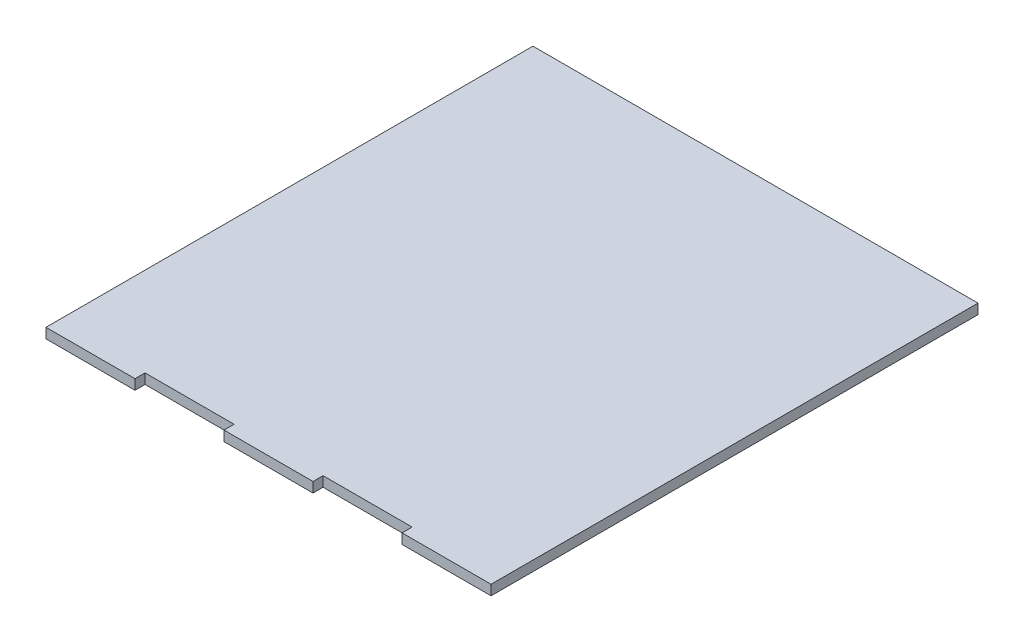
ISO-10303-21;
HEADER;
FILE_DESCRIPTION(('STEP AP214'),'2;1');
FILE_NAME('part.step','',(''),(''),'','','');
FILE_SCHEMA(('AUTOMOTIVE_DESIGN { 1 0 10303 214 1 1 1 1 }'));
ENDSEC;
DATA;
#1=APPLICATION_CONTEXT('core data for automotive mechanical design processes');
#2=APPLICATION_PROTOCOL_DEFINITION('international standard','automotive_design',2000,#1);
#3=PRODUCT_CONTEXT('',#1,'mechanical');
#4=PRODUCT('Part','Part','',(#3));
#5=PRODUCT_RELATED_PRODUCT_CATEGORY('part','',(#4));
#6=PRODUCT_DEFINITION_FORMATION('','',#4);
#7=PRODUCT_DEFINITION_CONTEXT('part definition',#1,'design');
#8=PRODUCT_DEFINITION('design','',#6,#7);
#9=PRODUCT_DEFINITION_SHAPE('','',#8);
#10=(LENGTH_UNIT() NAMED_UNIT(*) SI_UNIT(.MILLI.,.METRE.));
#11=(NAMED_UNIT(*) PLANE_ANGLE_UNIT() SI_UNIT($,.RADIAN.));
#12=(NAMED_UNIT(*) SI_UNIT($,.STERADIAN.) SOLID_ANGLE_UNIT());
#13=UNCERTAINTY_MEASURE_WITH_UNIT(LENGTH_MEASURE(1.E-05),#10,'distance_accuracy_value','');
#14=(GEOMETRIC_REPRESENTATION_CONTEXT(3) GLOBAL_UNCERTAINTY_ASSIGNED_CONTEXT((#13)) GLOBAL_UNIT_ASSIGNED_CONTEXT((#10,
#11,#12)) REPRESENTATION_CONTEXT('',''));
#15=CARTESIAN_POINT('',(0.,0.,0.));
#16=DIRECTION('',(0.,0.,1.));
#17=DIRECTION('',(1.,0.,0.));
#18=AXIS2_PLACEMENT_3D('',#15,#16,#17);
#19=CARTESIAN_POINT('',(-69.720993227991,8.3312,-3.44018058690745));
#20=DIRECTION('',(0.,0.,-1.));
#21=DIRECTION('',(-1.,0.,0.));
#22=AXIS2_PLACEMENT_3D('',#19,#20,#21);
#23=PLANE('',#22);
#24=DIRECTION('',(1.,0.,0.));
#25=VECTOR('',#24,1.);
#26=CARTESIAN_POINT('',(-69.720993227991,0.,-3.44018058690745));
#27=LINE('',#26,#25);
#28=CARTESIAN_POINT('',(-69.720993227991,0.,-3.44018058690745));
#29=VERTEX_POINT('',#28);
#30=CARTESIAN_POINT('',(4.10410677200893,0.,-3.44018058690745));
#31=VERTEX_POINT('',#30);
#32=EDGE_CURVE('E196',#29,#31,#27,.T.);
#33=ORIENTED_EDGE('',*,*,#32,.T.);
#34=DIRECTION('',(0.,-1.,0.));
#35=VECTOR('',#34,1.);
#36=CARTESIAN_POINT('',(4.10410677200893,8.3312,-3.44018058690745));
#37=LINE('',#36,#35);
#38=CARTESIAN_POINT('',(4.10410677200893,8.3312,-3.44018058690745));
#39=VERTEX_POINT('',#38);
#40=EDGE_CURVE('E152',#39,#31,#37,.T.);
#41=ORIENTED_EDGE('',*,*,#40,.F.);
#42=DIRECTION('',(1.,0.,0.));
#43=VECTOR('',#42,1.);
#44=CARTESIAN_POINT('',(-69.720993227991,8.3312,-3.44018058690745));
#45=LINE('',#44,#43);
#46=CARTESIAN_POINT('',(-69.720993227991,8.3312,-3.44018058690745));
#47=VERTEX_POINT('',#46);
#48=EDGE_CURVE('E142',#47,#39,#45,.T.);
#49=ORIENTED_EDGE('',*,*,#48,.F.);
#50=DIRECTION('',(0.,-1.,0.));
#51=VECTOR('',#50,1.);
#52=CARTESIAN_POINT('',(-69.720993227991,8.3312,-3.44018058690745));
#53=LINE('',#52,#51);
#54=EDGE_CURVE('E11',#47,#29,#53,.T.);
#55=ORIENTED_EDGE('',*,*,#54,.T.);
#56=EDGE_LOOP('',(#33,#41,#49,#55));
#57=FACE_BOUND('',#56,.T.);
#58=ADVANCED_FACE('F33',(#57),#23,.F.);
#59=CARTESIAN_POINT('',(225.579406772009,8.3312,-3.44018058690742));
#60=VERTEX_POINT('',#59);
#61=CARTESIAN_POINT('',(299.404506772009,8.3312,-3.44018058690745));
#62=VERTEX_POINT('',#61);
#63=EDGE_CURVE('E184',#60,#62,#45,.T.);
#64=ORIENTED_EDGE('',*,*,#63,.F.);
#65=DIRECTION('',(0.,-1.,0.));
#66=VECTOR('',#65,1.);
#67=CARTESIAN_POINT('',(225.579406772009,8.3312,-3.44018058690742));
#68=LINE('',#67,#66);
#69=CARTESIAN_POINT('',(225.579406772009,0.,-3.44018058690742));
#70=VERTEX_POINT('',#69);
#71=EDGE_CURVE('E169',#60,#70,#68,.T.);
#72=ORIENTED_EDGE('',*,*,#71,.T.);
#73=CARTESIAN_POINT('',(299.404506772009,0.,-3.44018058690745));
#74=VERTEX_POINT('',#73);
#75=EDGE_CURVE('E195',#70,#74,#27,.T.);
#76=ORIENTED_EDGE('',*,*,#75,.T.);
#77=DIRECTION('',(0.,-1.,0.));
#78=VECTOR('',#77,1.);
#79=CARTESIAN_POINT('',(299.404506772009,8.3312,-3.44018058690745));
#80=LINE('',#79,#78);
#81=EDGE_CURVE('E41',#62,#74,#80,.T.);
#82=ORIENTED_EDGE('',*,*,#81,.F.);
#83=EDGE_LOOP('',(#64,#72,#76,#82));
#84=FACE_BOUND('',#83,.T.);
#85=ADVANCED_FACE('F237',(#84),#23,.F.);
#86=CARTESIAN_POINT('',(-69.720993227991,8.3312,-407.330660586907));
#87=DIRECTION('',(1.,0.,0.));
#88=DIRECTION('',(0.,0.,-1.));
#89=AXIS2_PLACEMENT_3D('',#86,#87,#88);
#90=PLANE('',#89);
#91=DIRECTION('',(0.,0.,1.));
#92=VECTOR('',#91,1.);
#93=CARTESIAN_POINT('',(-69.720993227991,0.,-407.330660586907));
#94=LINE('',#93,#92);
#95=CARTESIAN_POINT('',(-69.720993227991,0.,-407.330660586907));
#96=VERTEX_POINT('',#95);
#97=EDGE_CURVE('E154',#96,#29,#94,.T.);
#98=ORIENTED_EDGE('',*,*,#97,.T.);
#99=ORIENTED_EDGE('',*,*,#54,.F.);
#100=DIRECTION('',(0.,0.,1.));
#101=VECTOR('',#100,1.);
#102=CARTESIAN_POINT('',(-69.720993227991,8.3312,-407.330660586907));
#103=LINE('',#102,#101);
#104=CARTESIAN_POINT('',(-69.720993227991,8.3312,-407.330660586907));
#105=VERTEX_POINT('',#104);
#106=EDGE_CURVE('E182',#105,#47,#103,.T.);
#107=ORIENTED_EDGE('',*,*,#106,.F.);
#108=DIRECTION('',(0.,-1.,0.));
#109=VECTOR('',#108,1.);
#110=CARTESIAN_POINT('',(-69.720993227991,8.3312,-407.330660586907));
#111=LINE('',#110,#109);
#112=EDGE_CURVE('E192',#105,#96,#111,.T.);
#113=ORIENTED_EDGE('',*,*,#112,.T.);
#114=EDGE_LOOP('',(#98,#99,#107,#113));
#115=FACE_BOUND('',#114,.T.);
#116=ADVANCED_FACE('F35',(#115),#90,.F.);
#117=CARTESIAN_POINT('',(77.9292067720089,8.3312,-3.44018058690745));
#118=VERTEX_POINT('',#117);
#119=CARTESIAN_POINT('',(151.754306772009,8.3312,-3.44018058690744));
#120=VERTEX_POINT('',#119);
#121=EDGE_CURVE('E188',#118,#120,#45,.T.);
#122=ORIENTED_EDGE('',*,*,#121,.F.);
#123=DIRECTION('',(0.,-1.,0.));
#124=VECTOR('',#123,1.);
#125=CARTESIAN_POINT('',(77.9292067720089,8.3312,-3.44018058690745));
#126=LINE('',#125,#124);
#127=CARTESIAN_POINT('',(77.9292067720089,0.,-3.44018058690745));
#128=VERTEX_POINT('',#127);
#129=EDGE_CURVE('E155',#118,#128,#126,.T.);
#130=ORIENTED_EDGE('',*,*,#129,.T.);
#131=CARTESIAN_POINT('',(151.754306772009,0.,-3.44018058690745));
#132=VERTEX_POINT('',#131);
#133=EDGE_CURVE('E200',#128,#132,#27,.T.);
#134=ORIENTED_EDGE('',*,*,#133,.T.);
#135=DIRECTION('',(0.,-1.,0.));
#136=VECTOR('',#135,1.);
#137=CARTESIAN_POINT('',(151.754306772009,8.3312,-3.44018058690744));
#138=LINE('',#137,#136);
#139=EDGE_CURVE('E56',#120,#132,#138,.T.);
#140=ORIENTED_EDGE('',*,*,#139,.F.);
#141=EDGE_LOOP('',(#122,#130,#134,#140));
#142=FACE_BOUND('',#141,.T.);
#143=ADVANCED_FACE('F233',(#142),#23,.F.);
#144=CARTESIAN_POINT('',(299.404506772009,8.3312,-407.330660586907));
#145=DIRECTION('',(-1.,0.,0.));
#146=DIRECTION('',(0.,0.,1.));
#147=AXIS2_PLACEMENT_3D('',#144,#145,#146);
#148=PLANE('',#147);
#149=DIRECTION('',(0.,0.,-1.));
#150=VECTOR('',#149,1.);
#151=CARTESIAN_POINT('',(299.404506772009,0.,-407.330660586907));
#152=LINE('',#151,#150);
#153=CARTESIAN_POINT('',(299.404506772009,0.,-407.330660586907));
#154=VERTEX_POINT('',#153);
#155=EDGE_CURVE('E199',#74,#154,#152,.T.);
#156=ORIENTED_EDGE('',*,*,#155,.T.);
#157=DIRECTION('',(0.,-1.,0.));
#158=VECTOR('',#157,1.);
#159=CARTESIAN_POINT('',(299.404506772009,8.3312,-407.330660586907));
#160=LINE('',#159,#158);
#161=CARTESIAN_POINT('',(299.404506772009,8.3312,-407.330660586907));
#162=VERTEX_POINT('',#161);
#163=EDGE_CURVE('E205',#162,#154,#160,.T.);
#164=ORIENTED_EDGE('',*,*,#163,.F.);
#165=DIRECTION('',(0.,0.,-1.));
#166=VECTOR('',#165,1.);
#167=CARTESIAN_POINT('',(299.404506772009,8.3312,-407.330660586907));
#168=LINE('',#167,#166);
#169=EDGE_CURVE('E187',#62,#162,#168,.T.);
#170=ORIENTED_EDGE('',*,*,#169,.F.);
#171=ORIENTED_EDGE('',*,*,#81,.T.);
#172=EDGE_LOOP('',(#156,#164,#170,#171));
#173=FACE_BOUND('',#172,.T.);
#174=ADVANCED_FACE('F212',(#173),#148,.F.);
#175=CARTESIAN_POINT('',(-69.720993227991,8.3312,-407.330660586907));
#176=DIRECTION('',(0.,0.,1.));
#177=DIRECTION('',(1.,0.,0.));
#178=AXIS2_PLACEMENT_3D('',#175,#176,#177);
#179=PLANE('',#178);
#180=DIRECTION('',(-1.,0.,0.));
#181=VECTOR('',#180,1.);
#182=CARTESIAN_POINT('',(-69.720993227991,0.,-407.330660586907));
#183=LINE('',#182,#181);
#184=EDGE_CURVE('E185',#154,#96,#183,.T.);
#185=ORIENTED_EDGE('',*,*,#184,.T.);
#186=ORIENTED_EDGE('',*,*,#112,.F.);
#187=DIRECTION('',(-1.,0.,0.));
#188=VECTOR('',#187,1.);
#189=CARTESIAN_POINT('',(-69.720993227991,8.3312,-407.330660586907));
#190=LINE('',#189,#188);
#191=EDGE_CURVE('E190',#162,#105,#190,.T.);
#192=ORIENTED_EDGE('',*,*,#191,.F.);
#193=ORIENTED_EDGE('',*,*,#163,.T.);
#194=EDGE_LOOP('',(#185,#186,#192,#193));
#195=FACE_BOUND('',#194,.T.);
#196=ADVANCED_FACE('F224',(#195),#179,.F.);
#197=CARTESIAN_POINT('',(0.,8.3312,0.));
#198=DIRECTION('',(0.,1.,0.));
#199=DIRECTION('',(0.,0.,1.));
#200=AXIS2_PLACEMENT_3D('',#197,#198,#199);
#201=PLANE('',#200);
#202=DIRECTION('',(0.,0.,-1.));
#203=VECTOR('',#202,1.);
#204=CARTESIAN_POINT('',(4.10410677200893,8.3312,-3.44018058690745));
#205=LINE('',#204,#203);
#206=CARTESIAN_POINT('',(4.10410677200895,8.3312,-11.7713805869075));
#207=VERTEX_POINT('',#206);
#208=EDGE_CURVE('E124',#39,#207,#205,.T.);
#209=ORIENTED_EDGE('',*,*,#208,.T.);
#210=DIRECTION('',(1.,0.,0.));
#211=VECTOR('',#210,1.);
#212=CARTESIAN_POINT('',(4.10410677200895,8.3312,-11.7713805869075));
#213=LINE('',#212,#211);
#214=CARTESIAN_POINT('',(77.9292067720089,8.3312,-11.7713805869075));
#215=VERTEX_POINT('',#214);
#216=EDGE_CURVE('E133',#207,#215,#213,.T.);
#217=ORIENTED_EDGE('',*,*,#216,.T.);
#218=DIRECTION('',(0.,0.,1.));
#219=VECTOR('',#218,1.);
#220=CARTESIAN_POINT('',(77.9292067720089,8.3312,-3.44018058690745));
#221=LINE('',#220,#219);
#222=EDGE_CURVE('E130',#215,#118,#221,.T.);
#223=ORIENTED_EDGE('',*,*,#222,.T.);
#224=ORIENTED_EDGE('',*,*,#121,.T.);
#225=DIRECTION('',(0.,0.,-1.));
#226=VECTOR('',#225,1.);
#227=CARTESIAN_POINT('',(151.754306772009,8.3312,-3.44018058690744));
#228=LINE('',#227,#226);
#229=CARTESIAN_POINT('',(151.754306772009,8.3312,-11.7713805869074));
#230=VERTEX_POINT('',#229);
#231=EDGE_CURVE('E162',#120,#230,#228,.T.);
#232=ORIENTED_EDGE('',*,*,#231,.T.);
#233=DIRECTION('',(1.,0.,0.));
#234=VECTOR('',#233,1.);
#235=CARTESIAN_POINT('',(225.579406772009,8.3312,-11.7713805869074));
#236=LINE('',#235,#234);
#237=CARTESIAN_POINT('',(225.579406772009,8.3312,-11.7713805869074));
#238=VERTEX_POINT('',#237);
#239=EDGE_CURVE('E166',#230,#238,#236,.T.);
#240=ORIENTED_EDGE('',*,*,#239,.T.);
#241=DIRECTION('',(0.,0.,1.));
#242=VECTOR('',#241,1.);
#243=CARTESIAN_POINT('',(225.579406772009,8.3312,-3.44018058690742));
#244=LINE('',#243,#242);
#245=EDGE_CURVE('E159',#238,#60,#244,.T.);
#246=ORIENTED_EDGE('',*,*,#245,.T.);
#247=ORIENTED_EDGE('',*,*,#63,.T.);
#248=ORIENTED_EDGE('',*,*,#169,.T.);
#249=ORIENTED_EDGE('',*,*,#191,.T.);
#250=ORIENTED_EDGE('',*,*,#106,.T.);
#251=ORIENTED_EDGE('',*,*,#48,.T.);
#252=EDGE_LOOP('',(#209,#217,#223,#224,#232,#240,#246,#247,#248,#249,#250,#251));
#253=FACE_BOUND('',#252,.T.);
#254=ADVANCED_FACE('F140',(#253),#201,.T.);
#255=CARTESIAN_POINT('',(0.,0.,0.));
#256=DIRECTION('',(0.,1.,0.));
#257=DIRECTION('',(0.,0.,1.));
#258=AXIS2_PLACEMENT_3D('',#255,#256,#257);
#259=PLANE('',#258);
#260=DIRECTION('',(1.,0.,0.));
#261=VECTOR('',#260,1.);
#262=CARTESIAN_POINT('',(4.10410677200895,0.,-11.7713805869075));
#263=LINE('',#262,#261);
#264=CARTESIAN_POINT('',(4.10410677200895,0.,-11.7713805869075));
#265=VERTEX_POINT('',#264);
#266=CARTESIAN_POINT('',(77.9292067720089,0.,-11.7713805869075));
#267=VERTEX_POINT('',#266);
#268=EDGE_CURVE('E145',#265,#267,#263,.T.);
#269=ORIENTED_EDGE('',*,*,#268,.F.);
#270=DIRECTION('',(0.,0.,-1.));
#271=VECTOR('',#270,1.);
#272=CARTESIAN_POINT('',(4.10410677200893,0.,-3.44018058690745));
#273=LINE('',#272,#271);
#274=EDGE_CURVE('E48',#31,#265,#273,.T.);
#275=ORIENTED_EDGE('',*,*,#274,.F.);
#276=ORIENTED_EDGE('',*,*,#32,.F.);
#277=ORIENTED_EDGE('',*,*,#97,.F.);
#278=ORIENTED_EDGE('',*,*,#184,.F.);
#279=ORIENTED_EDGE('',*,*,#155,.F.);
#280=ORIENTED_EDGE('',*,*,#75,.F.);
#281=DIRECTION('',(0.,0.,1.));
#282=VECTOR('',#281,1.);
#283=CARTESIAN_POINT('',(225.579406772009,0.,-3.44018058690742));
#284=LINE('',#283,#282);
#285=CARTESIAN_POINT('',(225.579406772009,0.,-11.7713805869074));
#286=VERTEX_POINT('',#285);
#287=EDGE_CURVE('E170',#286,#70,#284,.T.);
#288=ORIENTED_EDGE('',*,*,#287,.F.);
#289=DIRECTION('',(1.,0.,0.));
#290=VECTOR('',#289,1.);
#291=CARTESIAN_POINT('',(225.579406772009,0.,-11.7713805869074));
#292=LINE('',#291,#290);
#293=CARTESIAN_POINT('',(151.754306772009,0.,-11.7713805869074));
#294=VERTEX_POINT('',#293);
#295=EDGE_CURVE('E163',#294,#286,#292,.T.);
#296=ORIENTED_EDGE('',*,*,#295,.F.);
#297=DIRECTION('',(0.,0.,-1.));
#298=VECTOR('',#297,1.);
#299=CARTESIAN_POINT('',(151.754306772009,0.,-3.44018058690744));
#300=LINE('',#299,#298);
#301=EDGE_CURVE('E172',#132,#294,#300,.T.);
#302=ORIENTED_EDGE('',*,*,#301,.F.);
#303=ORIENTED_EDGE('',*,*,#133,.F.);
#304=DIRECTION('',(0.,0.,1.));
#305=VECTOR('',#304,1.);
#306=CARTESIAN_POINT('',(77.9292067720089,0.,-3.44018058690745));
#307=LINE('',#306,#305);
#308=EDGE_CURVE('E143',#267,#128,#307,.T.);
#309=ORIENTED_EDGE('',*,*,#308,.F.);
#310=EDGE_LOOP('',(#269,#275,#276,#277,#278,#279,#280,#288,#296,#302,#303,#309));
#311=FACE_BOUND('',#310,.T.);
#312=ADVANCED_FACE('F219',(#311),#259,.F.);
#313=CARTESIAN_POINT('',(225.579406772009,8.3312,-3.44018058690742));
#314=DIRECTION('',(1.,0.,0.));
#315=DIRECTION('',(0.,0.,-1.));
#316=AXIS2_PLACEMENT_3D('',#313,#314,#315);
#317=PLANE('',#316);
#318=ORIENTED_EDGE('',*,*,#287,.T.);
#319=ORIENTED_EDGE('',*,*,#71,.F.);
#320=ORIENTED_EDGE('',*,*,#245,.F.);
#321=DIRECTION('',(0.,-1.,0.));
#322=VECTOR('',#321,1.);
#323=CARTESIAN_POINT('',(225.579406772009,8.3312,-11.7713805869074));
#324=LINE('',#323,#322);
#325=EDGE_CURVE('E150',#238,#286,#324,.T.);
#326=ORIENTED_EDGE('',*,*,#325,.T.);
#327=EDGE_LOOP('',(#318,#319,#320,#326));
#328=FACE_BOUND('',#327,.T.);
#329=ADVANCED_FACE('F239',(#328),#317,.F.);
#330=CARTESIAN_POINT('',(225.579406772009,8.3312,-11.7713805869074));
#331=DIRECTION('',(0.,0.,-1.));
#332=DIRECTION('',(-1.,0.,0.));
#333=AXIS2_PLACEMENT_3D('',#330,#331,#332);
#334=PLANE('',#333);
#335=ORIENTED_EDGE('',*,*,#295,.T.);
#336=ORIENTED_EDGE('',*,*,#325,.F.);
#337=ORIENTED_EDGE('',*,*,#239,.F.);
#338=DIRECTION('',(0.,-1.,0.));
#339=VECTOR('',#338,1.);
#340=CARTESIAN_POINT('',(151.754306772009,8.3312,-11.7713805869074));
#341=LINE('',#340,#339);
#342=EDGE_CURVE('E177',#230,#294,#341,.T.);
#343=ORIENTED_EDGE('',*,*,#342,.T.);
#344=EDGE_LOOP('',(#335,#336,#337,#343));
#345=FACE_BOUND('',#344,.T.);
#346=ADVANCED_FACE('F242',(#345),#334,.F.);
#347=CARTESIAN_POINT('',(151.754306772009,8.3312,-3.44018058690744));
#348=DIRECTION('',(-1.,0.,0.));
#349=DIRECTION('',(0.,0.,1.));
#350=AXIS2_PLACEMENT_3D('',#347,#348,#349);
#351=PLANE('',#350);
#352=ORIENTED_EDGE('',*,*,#301,.T.);
#353=ORIENTED_EDGE('',*,*,#342,.F.);
#354=ORIENTED_EDGE('',*,*,#231,.F.);
#355=ORIENTED_EDGE('',*,*,#139,.T.);
#356=EDGE_LOOP('',(#352,#353,#354,#355));
#357=FACE_BOUND('',#356,.T.);
#358=ADVANCED_FACE('F244',(#357),#351,.F.);
#359=CARTESIAN_POINT('',(4.10410677200893,8.3312,-3.44018058690745));
#360=DIRECTION('',(-1.,0.,0.));
#361=DIRECTION('',(0.,0.,1.));
#362=AXIS2_PLACEMENT_3D('',#359,#360,#361);
#363=PLANE('',#362);
#364=ORIENTED_EDGE('',*,*,#274,.T.);
#365=DIRECTION('',(0.,-1.,0.));
#366=VECTOR('',#365,1.);
#367=CARTESIAN_POINT('',(4.10410677200895,8.3312,-11.7713805869075));
#368=LINE('',#367,#366);
#369=EDGE_CURVE('E120',#207,#265,#368,.T.);
#370=ORIENTED_EDGE('',*,*,#369,.F.);
#371=ORIENTED_EDGE('',*,*,#208,.F.);
#372=ORIENTED_EDGE('',*,*,#40,.T.);
#373=EDGE_LOOP('',(#364,#370,#371,#372));
#374=FACE_BOUND('',#373,.T.);
#375=ADVANCED_FACE('F122',(#374),#363,.F.);
#376=CARTESIAN_POINT('',(77.9292067720089,8.3312,-3.44018058690745));
#377=DIRECTION('',(1.,0.,0.));
#378=DIRECTION('',(0.,0.,-1.));
#379=AXIS2_PLACEMENT_3D('',#376,#377,#378);
#380=PLANE('',#379);
#381=ORIENTED_EDGE('',*,*,#308,.T.);
#382=ORIENTED_EDGE('',*,*,#129,.F.);
#383=ORIENTED_EDGE('',*,*,#222,.F.);
#384=DIRECTION('',(0.,-1.,0.));
#385=VECTOR('',#384,1.);
#386=CARTESIAN_POINT('',(77.9292067720089,8.3312,-11.7713805869075));
#387=LINE('',#386,#385);
#388=EDGE_CURVE('E129',#215,#267,#387,.T.);
#389=ORIENTED_EDGE('',*,*,#388,.T.);
#390=EDGE_LOOP('',(#381,#382,#383,#389));
#391=FACE_BOUND('',#390,.T.);
#392=ADVANCED_FACE('F251',(#391),#380,.F.);
#393=CARTESIAN_POINT('',(4.10410677200895,8.3312,-11.7713805869075));
#394=DIRECTION('',(0.,0.,-1.));
#395=DIRECTION('',(-1.,0.,0.));
#396=AXIS2_PLACEMENT_3D('',#393,#394,#395);
#397=PLANE('',#396);
#398=ORIENTED_EDGE('',*,*,#268,.T.);
#399=ORIENTED_EDGE('',*,*,#388,.F.);
#400=ORIENTED_EDGE('',*,*,#216,.F.);
#401=ORIENTED_EDGE('',*,*,#369,.T.);
#402=EDGE_LOOP('',(#398,#399,#400,#401));
#403=FACE_BOUND('',#402,.T.);
#404=ADVANCED_FACE('F134',(#403),#397,.F.);
#405=CLOSED_SHELL('',(#58,#85,#116,#143,#174,#196,#254,#312,#329,#346,#358,#375,#392,#404));
#406=MANIFOLD_SOLID_BREP('B2',#405);
#407=ADVANCED_BREP_SHAPE_REPRESENTATION('',(#18,#406),#14);
#408=SHAPE_DEFINITION_REPRESENTATION(#9,#407);
ENDSEC;
END-ISO-10303-21;
